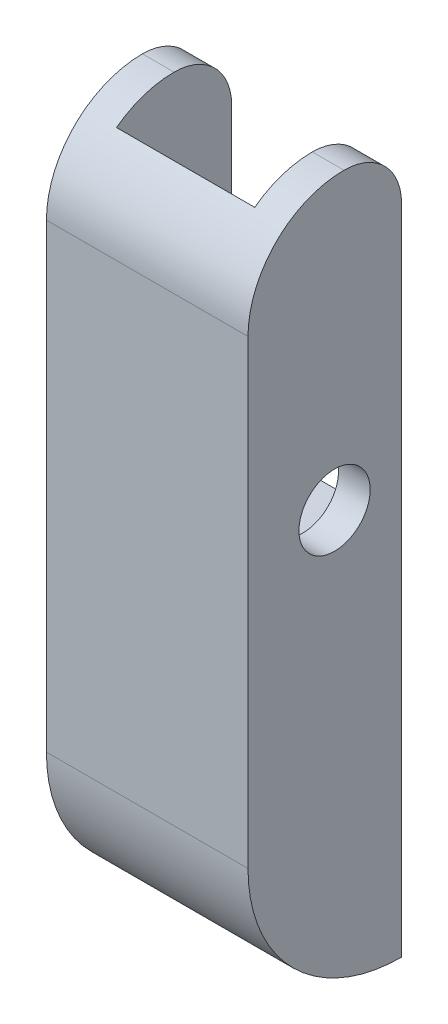
ISO-10303-21;
HEADER;
FILE_DESCRIPTION(('STEP AP214'),'2;1');
FILE_NAME('part.step','',(''),(''),'','','');
FILE_SCHEMA(('AUTOMOTIVE_DESIGN { 1 0 10303 214 1 1 1 1 }'));
ENDSEC;
DATA;
#1=APPLICATION_CONTEXT('core data for automotive mechanical design processes');
#2=APPLICATION_PROTOCOL_DEFINITION('international standard','automotive_design',2000,#1);
#3=PRODUCT_CONTEXT('',#1,'mechanical');
#4=PRODUCT('Part','Part','',(#3));
#5=PRODUCT_RELATED_PRODUCT_CATEGORY('part','',(#4));
#6=PRODUCT_DEFINITION_FORMATION('','',#4);
#7=PRODUCT_DEFINITION_CONTEXT('part definition',#1,'design');
#8=PRODUCT_DEFINITION('design','',#6,#7);
#9=PRODUCT_DEFINITION_SHAPE('','',#8);
#10=(LENGTH_UNIT() NAMED_UNIT(*) SI_UNIT(.MILLI.,.METRE.));
#11=(NAMED_UNIT(*) PLANE_ANGLE_UNIT() SI_UNIT($,.RADIAN.));
#12=(NAMED_UNIT(*) SI_UNIT($,.STERADIAN.) SOLID_ANGLE_UNIT());
#13=UNCERTAINTY_MEASURE_WITH_UNIT(LENGTH_MEASURE(1.E-05),#10,'distance_accuracy_value','');
#14=(GEOMETRIC_REPRESENTATION_CONTEXT(3) GLOBAL_UNCERTAINTY_ASSIGNED_CONTEXT((#13)) GLOBAL_UNIT_ASSIGNED_CONTEXT((#10,
#11,#12)) REPRESENTATION_CONTEXT('',''));
#15=CARTESIAN_POINT('',(0.,0.,0.));
#16=DIRECTION('',(0.,0.,1.));
#17=DIRECTION('',(1.,0.,0.));
#18=AXIS2_PLACEMENT_3D('',#15,#16,#17);
#19=CARTESIAN_POINT('',(0.,43.18,3.81));
#20=DIRECTION('',(-1.,0.,0.));
#21=DIRECTION('',(0.,0.,1.));
#22=AXIS2_PLACEMENT_3D('',#19,#20,#21);
#23=CYLINDRICAL_SURFACE('',#22,3.81);
#24=CARTESIAN_POINT('',(11.2395,43.18,3.81));
#25=DIRECTION('',(1.,0.,0.));
#26=DIRECTION('',(0.,1.,0.));
#27=AXIS2_PLACEMENT_3D('',#24,#25,#26);
#28=CIRCLE('',#27,3.81);
#29=CARTESIAN_POINT('',(11.2395,46.99,3.81));
#30=VERTEX_POINT('',#29);
#31=CARTESIAN_POINT('',(11.2395,43.18,0.));
#32=VERTEX_POINT('',#31);
#33=EDGE_CURVE('E179',#30,#32,#28,.F.);
#34=ORIENTED_EDGE('',*,*,#33,.F.);
#35=DIRECTION('',(1.,0.,0.));
#36=VECTOR('',#35,1.);
#37=CARTESIAN_POINT('',(0.,46.99,3.81));
#38=LINE('',#37,#36);
#39=CARTESIAN_POINT('',(13.335,46.99,3.81));
#40=VERTEX_POINT('',#39);
#41=EDGE_CURVE('E171',#40,#30,#38,.F.);
#42=ORIENTED_EDGE('',*,*,#41,.F.);
#43=CARTESIAN_POINT('',(13.335,43.18,3.81));
#44=DIRECTION('',(-1.,0.,0.));
#45=DIRECTION('',(0.,0.,1.));
#46=AXIS2_PLACEMENT_3D('',#43,#44,#45);
#47=CIRCLE('',#46,3.81);
#48=CARTESIAN_POINT('',(13.335,43.18,0.));
#49=VERTEX_POINT('',#48);
#50=EDGE_CURVE('E168',#49,#40,#47,.F.);
#51=ORIENTED_EDGE('',*,*,#50,.F.);
#52=DIRECTION('',(1.,0.,0.));
#53=VECTOR('',#52,1.);
#54=CARTESIAN_POINT('',(13.335,43.18,0.));
#55=LINE('',#54,#53);
#56=EDGE_CURVE('E158',#32,#49,#55,.T.);
#57=ORIENTED_EDGE('',*,*,#56,.F.);
#58=EDGE_LOOP('',(#34,#42,#51,#57));
#59=FACE_BOUND('',#58,.T.);
#60=ADVANCED_FACE('F41',(#59),#23,.T.);
#61=CARTESIAN_POINT('',(13.335,0.,10.16));
#62=DIRECTION('',(-1.,0.,0.));
#63=DIRECTION('',(0.,0.,1.));
#64=AXIS2_PLACEMENT_3D('',#61,#62,#63);
#65=PLANE('',#64);
#66=CARTESIAN_POINT('',(13.335,27.8257,4.4323));
#67=DIRECTION('',(-1.,0.,0.));
#68=DIRECTION('',(0.,0.,1.));
#69=AXIS2_PLACEMENT_3D('',#66,#67,#68);
#70=CIRCLE('',#69,2.35585);
#71=CARTESIAN_POINT('',(13.335,27.8257,6.78815));
#72=VERTEX_POINT('',#71);
#73=EDGE_CURVE('E186',#72,#72,#70,.T.);
#74=ORIENTED_EDGE('',*,*,#73,.T.);
#75=EDGE_LOOP('',(#74));
#76=FACE_BOUND('',#75,.T.);
#77=DIRECTION('',(0.,1.,0.));
#78=VECTOR('',#77,1.);
#79=CARTESIAN_POINT('',(13.335,0.,10.16));
#80=LINE('',#79,#78);
#81=CARTESIAN_POINT('',(13.335,10.16,10.16));
#82=VERTEX_POINT('',#81);
#83=CARTESIAN_POINT('',(13.335,40.64,10.16));
#84=VERTEX_POINT('',#83);
#85=EDGE_CURVE('E153',#82,#84,#80,.T.);
#86=ORIENTED_EDGE('',*,*,#85,.F.);
#87=CARTESIAN_POINT('',(13.335,10.16,0.));
#88=DIRECTION('',(-1.,0.,0.));
#89=DIRECTION('',(0.,0.,1.));
#90=AXIS2_PLACEMENT_3D('',#87,#88,#89);
#91=CIRCLE('',#90,10.16);
#92=CARTESIAN_POINT('',(13.335,0.,0.));
#93=VERTEX_POINT('',#92);
#94=EDGE_CURVE('E49',#82,#93,#91,.F.);
#95=ORIENTED_EDGE('',*,*,#94,.T.);
#96=DIRECTION('',(0.,1.,0.));
#97=VECTOR('',#96,1.);
#98=CARTESIAN_POINT('',(13.335,0.,0.));
#99=LINE('',#98,#97);
#100=EDGE_CURVE('E160',#93,#49,#99,.T.);
#101=ORIENTED_EDGE('',*,*,#100,.T.);
#102=ORIENTED_EDGE('',*,*,#50,.T.);
#103=CARTESIAN_POINT('',(13.335,40.64,3.81));
#104=DIRECTION('',(-1.,0.,0.));
#105=DIRECTION('',(0.,0.,1.));
#106=AXIS2_PLACEMENT_3D('',#103,#104,#105);
#107=CIRCLE('',#106,6.35);
#108=EDGE_CURVE('E191',#40,#84,#107,.F.);
#109=ORIENTED_EDGE('',*,*,#108,.T.);
#110=EDGE_LOOP('',(#86,#95,#101,#102,#109));
#111=FACE_BOUND('',#110,.T.);
#112=ADVANCED_FACE('F203',(#76,#111),#65,.F.);
#113=CARTESIAN_POINT('',(0.,0.,10.16));
#114=DIRECTION('',(-1.,0.,0.));
#115=DIRECTION('',(0.,0.,1.));
#116=AXIS2_PLACEMENT_3D('',#113,#114,#115);
#117=PLANE('',#116);
#118=CARTESIAN_POINT('',(0.,27.8257,4.4323));
#119=DIRECTION('',(-1.,0.,0.));
#120=DIRECTION('',(0.,0.,1.));
#121=AXIS2_PLACEMENT_3D('',#118,#119,#120);
#122=CIRCLE('',#121,2.35585);
#123=CARTESIAN_POINT('',(0.,27.8257,6.78815));
#124=VERTEX_POINT('',#123);
#125=EDGE_CURVE('E148',#124,#124,#122,.T.);
#126=ORIENTED_EDGE('',*,*,#125,.F.);
#127=EDGE_LOOP('',(#126));
#128=FACE_BOUND('',#127,.T.);
#129=DIRECTION('',(0.,1.,0.));
#130=VECTOR('',#129,1.);
#131=CARTESIAN_POINT('',(0.,0.,0.));
#132=LINE('',#131,#130);
#133=CARTESIAN_POINT('',(0.,0.,0.));
#134=VERTEX_POINT('',#133);
#135=CARTESIAN_POINT('',(0.,43.18,0.));
#136=VERTEX_POINT('',#135);
#137=EDGE_CURVE('E156',#134,#136,#132,.T.);
#138=ORIENTED_EDGE('',*,*,#137,.F.);
#139=CARTESIAN_POINT('',(0.,10.16,0.));
#140=DIRECTION('',(-1.,0.,0.));
#141=DIRECTION('',(0.,0.,1.));
#142=AXIS2_PLACEMENT_3D('',#139,#140,#141);
#143=CIRCLE('',#142,10.16);
#144=CARTESIAN_POINT('',(0.,10.16,10.16));
#145=VERTEX_POINT('',#144);
#146=EDGE_CURVE('E12',#134,#145,#143,.T.);
#147=ORIENTED_EDGE('',*,*,#146,.T.);
#148=DIRECTION('',(0.,1.,0.));
#149=VECTOR('',#148,1.);
#150=CARTESIAN_POINT('',(0.,0.,10.16));
#151=LINE('',#150,#149);
#152=CARTESIAN_POINT('',(0.,40.64,10.16));
#153=VERTEX_POINT('',#152);
#154=EDGE_CURVE('E155',#145,#153,#151,.T.);
#155=ORIENTED_EDGE('',*,*,#154,.T.);
#156=CARTESIAN_POINT('',(0.,40.64,3.81));
#157=DIRECTION('',(-1.,0.,0.));
#158=DIRECTION('',(0.,0.,1.));
#159=AXIS2_PLACEMENT_3D('',#156,#157,#158);
#160=CIRCLE('',#159,6.35);
#161=CARTESIAN_POINT('',(0.,46.99,3.81));
#162=VERTEX_POINT('',#161);
#163=EDGE_CURVE('E197',#153,#162,#160,.T.);
#164=ORIENTED_EDGE('',*,*,#163,.T.);
#165=CARTESIAN_POINT('',(0.,43.18,3.81));
#166=DIRECTION('',(-1.,0.,0.));
#167=DIRECTION('',(0.,0.,1.));
#168=AXIS2_PLACEMENT_3D('',#165,#166,#167);
#169=CIRCLE('',#168,3.81);
#170=EDGE_CURVE('E174',#162,#136,#169,.T.);
#171=ORIENTED_EDGE('',*,*,#170,.T.);
#172=EDGE_LOOP('',(#138,#147,#155,#164,#171));
#173=FACE_BOUND('',#172,.T.);
#174=ADVANCED_FACE('F212',(#128,#173),#117,.T.);
#175=CARTESIAN_POINT('',(0.,0.,10.16));
#176=DIRECTION('',(0.,0.,1.));
#177=DIRECTION('',(1.,0.,0.));
#178=AXIS2_PLACEMENT_3D('',#175,#176,#177);
#179=PLANE('',#178);
#180=ORIENTED_EDGE('',*,*,#154,.F.);
#181=DIRECTION('',(1.,0.,0.));
#182=VECTOR('',#181,1.);
#183=CARTESIAN_POINT('',(13.335,10.16,10.16));
#184=LINE('',#183,#182);
#185=EDGE_CURVE('E199',#145,#82,#184,.T.);
#186=ORIENTED_EDGE('',*,*,#185,.T.);
#187=ORIENTED_EDGE('',*,*,#85,.T.);
#188=DIRECTION('',(1.,0.,0.));
#189=VECTOR('',#188,1.);
#190=CARTESIAN_POINT('',(0.,40.64,10.16));
#191=LINE('',#190,#189);
#192=EDGE_CURVE('E194',#84,#153,#191,.F.);
#193=ORIENTED_EDGE('',*,*,#192,.T.);
#194=EDGE_LOOP('',(#180,#186,#187,#193));
#195=FACE_BOUND('',#194,.T.);
#196=ADVANCED_FACE('F209',(#195),#179,.T.);
#197=CARTESIAN_POINT('',(0.,0.,0.));
#198=DIRECTION('',(0.,0.,1.));
#199=DIRECTION('',(1.,0.,0.));
#200=AXIS2_PLACEMENT_3D('',#197,#198,#199);
#201=PLANE('',#200);
#202=DIRECTION('',(-1.,0.,0.));
#203=VECTOR('',#202,1.);
#204=CARTESIAN_POINT('',(11.2395,24.638,0.));
#205=LINE('',#204,#203);
#206=CARTESIAN_POINT('',(11.2395,24.638,0.));
#207=VERTEX_POINT('',#206);
#208=CARTESIAN_POINT('',(2.0955,24.638,0.));
#209=VERTEX_POINT('',#208);
#210=EDGE_CURVE('E147',#207,#209,#205,.T.);
#211=ORIENTED_EDGE('',*,*,#210,.F.);
#212=DIRECTION('',(0.,-1.,0.));
#213=VECTOR('',#212,1.);
#214=CARTESIAN_POINT('',(11.2395,46.99,0.));
#215=LINE('',#214,#213);
#216=EDGE_CURVE('E133',#32,#207,#215,.T.);
#217=ORIENTED_EDGE('',*,*,#216,.F.);
#218=ORIENTED_EDGE('',*,*,#56,.T.);
#219=ORIENTED_EDGE('',*,*,#100,.F.);
#220=DIRECTION('',(1.,0.,0.));
#221=VECTOR('',#220,1.);
#222=CARTESIAN_POINT('',(0.,0.,0.));
#223=LINE('',#222,#221);
#224=EDGE_CURVE('E151',#134,#93,#223,.T.);
#225=ORIENTED_EDGE('',*,*,#224,.F.);
#226=ORIENTED_EDGE('',*,*,#137,.T.);
#227=CARTESIAN_POINT('',(2.0955,43.18,0.));
#228=VERTEX_POINT('',#227);
#229=EDGE_CURVE('E165',#136,#228,#55,.T.);
#230=ORIENTED_EDGE('',*,*,#229,.T.);
#231=DIRECTION('',(0.,1.,0.));
#232=VECTOR('',#231,1.);
#233=CARTESIAN_POINT('',(2.0955,46.99,0.));
#234=LINE('',#233,#232);
#235=EDGE_CURVE('E127',#209,#228,#234,.T.);
#236=ORIENTED_EDGE('',*,*,#235,.F.);
#237=EDGE_LOOP('',(#211,#217,#218,#219,#225,#226,#230,#236));
#238=FACE_BOUND('',#237,.T.);
#239=ADVANCED_FACE('F205',(#238),#201,.F.);
#240=CARTESIAN_POINT('',(2.0955,43.18,3.81));
#241=DIRECTION('',(-1.,0.,0.));
#242=DIRECTION('',(0.,-1.,0.));
#243=AXIS2_PLACEMENT_3D('',#240,#241,#242);
#244=CIRCLE('',#243,3.81);
#245=CARTESIAN_POINT('',(2.0955,46.99,3.81));
#246=VERTEX_POINT('',#245);
#247=EDGE_CURVE('E176',#228,#246,#244,.F.);
#248=ORIENTED_EDGE('',*,*,#247,.F.);
#249=ORIENTED_EDGE('',*,*,#229,.F.);
#250=ORIENTED_EDGE('',*,*,#170,.F.);
#251=EDGE_CURVE('E170',#246,#162,#38,.F.);
#252=ORIENTED_EDGE('',*,*,#251,.F.);
#253=EDGE_LOOP('',(#248,#249,#250,#252));
#254=FACE_BOUND('',#253,.T.);
#255=ADVANCED_FACE('F220',(#254),#23,.T.);
#256=CARTESIAN_POINT('',(11.2395,46.99,7.62));
#257=DIRECTION('',(1.,0.,0.));
#258=DIRECTION('',(0.,1.,0.));
#259=AXIS2_PLACEMENT_3D('',#256,#257,#258);
#260=PLANE('',#259);
#261=CARTESIAN_POINT('',(11.2395,27.8257,4.4323));
#262=DIRECTION('',(1.,0.,0.));
#263=DIRECTION('',(0.,1.,0.));
#264=AXIS2_PLACEMENT_3D('',#261,#262,#263);
#265=CIRCLE('',#264,2.35585);
#266=CARTESIAN_POINT('',(11.2395,30.18155,4.4323));
#267=VERTEX_POINT('',#266);
#268=EDGE_CURVE('E185',#267,#267,#265,.T.);
#269=ORIENTED_EDGE('',*,*,#268,.T.);
#270=EDGE_LOOP('',(#269));
#271=FACE_BOUND('',#270,.T.);
#272=DIRECTION('',(0.,-1.,0.));
#273=VECTOR('',#272,1.);
#274=CARTESIAN_POINT('',(11.2395,46.99,7.62));
#275=LINE('',#274,#273);
#276=CARTESIAN_POINT('',(11.2395,45.72,7.62));
#277=VERTEX_POINT('',#276);
#278=CARTESIAN_POINT('',(11.2395,24.638,7.62));
#279=VERTEX_POINT('',#278);
#280=EDGE_CURVE('E117',#277,#279,#275,.T.);
#281=ORIENTED_EDGE('',*,*,#280,.F.);
#282=CARTESIAN_POINT('',(11.2395,40.64,3.81));
#283=DIRECTION('',(1.,0.,0.));
#284=DIRECTION('',(0.,1.,0.));
#285=AXIS2_PLACEMENT_3D('',#282,#283,#284);
#286=CIRCLE('',#285,6.35);
#287=EDGE_CURVE('E189',#277,#30,#286,.F.);
#288=ORIENTED_EDGE('',*,*,#287,.T.);
#289=ORIENTED_EDGE('',*,*,#33,.T.);
#290=ORIENTED_EDGE('',*,*,#216,.T.);
#291=DIRECTION('',(0.,0.,-1.));
#292=VECTOR('',#291,1.);
#293=CARTESIAN_POINT('',(11.2395,24.638,7.62));
#294=LINE('',#293,#292);
#295=EDGE_CURVE('E130',#279,#207,#294,.T.);
#296=ORIENTED_EDGE('',*,*,#295,.F.);
#297=EDGE_LOOP('',(#281,#288,#289,#290,#296));
#298=FACE_BOUND('',#297,.T.);
#299=ADVANCED_FACE('F131',(#271,#298),#260,.F.);
#300=CARTESIAN_POINT('',(2.0955,46.99,7.62));
#301=DIRECTION('',(-1.,0.,0.));
#302=DIRECTION('',(0.,-1.,0.));
#303=AXIS2_PLACEMENT_3D('',#300,#301,#302);
#304=PLANE('',#303);
#305=CARTESIAN_POINT('',(2.0955,27.8257,4.4323));
#306=DIRECTION('',(-1.,0.,0.));
#307=DIRECTION('',(0.,-1.,0.));
#308=AXIS2_PLACEMENT_3D('',#305,#306,#307);
#309=CIRCLE('',#308,2.35585);
#310=CARTESIAN_POINT('',(2.0955,25.46985,4.4323));
#311=VERTEX_POINT('',#310);
#312=EDGE_CURVE('E182',#311,#311,#309,.T.);
#313=ORIENTED_EDGE('',*,*,#312,.T.);
#314=EDGE_LOOP('',(#313));
#315=FACE_BOUND('',#314,.T.);
#316=ORIENTED_EDGE('',*,*,#247,.T.);
#317=CARTESIAN_POINT('',(2.0955,40.64,3.81));
#318=DIRECTION('',(-1.,0.,0.));
#319=DIRECTION('',(0.,-1.,0.));
#320=AXIS2_PLACEMENT_3D('',#317,#318,#319);
#321=CIRCLE('',#320,6.35);
#322=CARTESIAN_POINT('',(2.0955,45.72,7.62));
#323=VERTEX_POINT('',#322);
#324=EDGE_CURVE('E181',#246,#323,#321,.F.);
#325=ORIENTED_EDGE('',*,*,#324,.T.);
#326=DIRECTION('',(0.,1.,0.));
#327=VECTOR('',#326,1.);
#328=CARTESIAN_POINT('',(2.0955,46.99,7.62));
#329=LINE('',#328,#327);
#330=CARTESIAN_POINT('',(2.0955,24.638,7.62));
#331=VERTEX_POINT('',#330);
#332=EDGE_CURVE('E138',#331,#323,#329,.T.);
#333=ORIENTED_EDGE('',*,*,#332,.F.);
#334=DIRECTION('',(0.,0.,-1.));
#335=VECTOR('',#334,1.);
#336=CARTESIAN_POINT('',(2.0955,24.638,7.62));
#337=LINE('',#336,#335);
#338=EDGE_CURVE('E137',#331,#209,#337,.T.);
#339=ORIENTED_EDGE('',*,*,#338,.T.);
#340=ORIENTED_EDGE('',*,*,#235,.T.);
#341=EDGE_LOOP('',(#316,#325,#333,#339,#340));
#342=FACE_BOUND('',#341,.T.);
#343=ADVANCED_FACE('F223',(#315,#342),#304,.F.);
#344=CARTESIAN_POINT('',(11.2395,24.638,7.62));
#345=DIRECTION('',(0.,-1.,0.));
#346=DIRECTION('',(0.,0.,-1.));
#347=AXIS2_PLACEMENT_3D('',#344,#345,#346);
#348=PLANE('',#347);
#349=ORIENTED_EDGE('',*,*,#210,.T.);
#350=ORIENTED_EDGE('',*,*,#338,.F.);
#351=DIRECTION('',(-1.,0.,0.));
#352=VECTOR('',#351,1.);
#353=CARTESIAN_POINT('',(11.2395,24.638,7.62));
#354=LINE('',#353,#352);
#355=EDGE_CURVE('E122',#279,#331,#354,.T.);
#356=ORIENTED_EDGE('',*,*,#355,.F.);
#357=ORIENTED_EDGE('',*,*,#295,.T.);
#358=EDGE_LOOP('',(#349,#350,#356,#357));
#359=FACE_BOUND('',#358,.T.);
#360=ADVANCED_FACE('F140',(#359),#348,.F.);
#361=CARTESIAN_POINT('',(0.,0.,7.62));
#362=DIRECTION('',(0.,0.,-1.));
#363=DIRECTION('',(-1.,0.,0.));
#364=AXIS2_PLACEMENT_3D('',#361,#362,#363);
#365=PLANE('',#364);
#366=ORIENTED_EDGE('',*,*,#332,.T.);
#367=DIRECTION('',(1.,0.,0.));
#368=VECTOR('',#367,1.);
#369=CARTESIAN_POINT('',(2.0955,45.72,7.62));
#370=LINE('',#369,#368);
#371=EDGE_CURVE('E124',#323,#277,#370,.T.);
#372=ORIENTED_EDGE('',*,*,#371,.T.);
#373=ORIENTED_EDGE('',*,*,#280,.T.);
#374=ORIENTED_EDGE('',*,*,#355,.T.);
#375=EDGE_LOOP('',(#366,#372,#373,#374));
#376=FACE_BOUND('',#375,.T.);
#377=ADVANCED_FACE('F120',(#376),#365,.T.);
#378=CARTESIAN_POINT('',(13.335,27.8257,4.4323));
#379=DIRECTION('',(-1.,0.,0.));
#380=DIRECTION('',(0.,0.,1.));
#381=AXIS2_PLACEMENT_3D('',#378,#379,#380);
#382=CYLINDRICAL_SURFACE('',#381,2.35585);
#383=ORIENTED_EDGE('',*,*,#125,.T.);
#384=EDGE_LOOP('',(#383));
#385=FACE_BOUND('',#384,.T.);
#386=ORIENTED_EDGE('',*,*,#312,.F.);
#387=EDGE_LOOP('',(#386));
#388=FACE_BOUND('',#387,.T.);
#389=ADVANCED_FACE('F265',(#385,#388),#382,.F.);
#390=ORIENTED_EDGE('',*,*,#73,.F.);
#391=EDGE_LOOP('',(#390));
#392=FACE_BOUND('',#391,.T.);
#393=ORIENTED_EDGE('',*,*,#268,.F.);
#394=EDGE_LOOP('',(#393));
#395=FACE_BOUND('',#394,.T.);
#396=ADVANCED_FACE('F262',(#392,#395),#382,.F.);
#397=CARTESIAN_POINT('',(0.,40.64,3.81));
#398=DIRECTION('',(1.,0.,0.));
#399=DIRECTION('',(0.,0.,-1.));
#400=AXIS2_PLACEMENT_3D('',#397,#398,#399);
#401=CYLINDRICAL_SURFACE('',#400,6.35);
#402=ORIENTED_EDGE('',*,*,#163,.F.);
#403=ORIENTED_EDGE('',*,*,#192,.F.);
#404=ORIENTED_EDGE('',*,*,#108,.F.);
#405=ORIENTED_EDGE('',*,*,#41,.T.);
#406=ORIENTED_EDGE('',*,*,#287,.F.);
#407=ORIENTED_EDGE('',*,*,#371,.F.);
#408=ORIENTED_EDGE('',*,*,#324,.F.);
#409=ORIENTED_EDGE('',*,*,#251,.T.);
#410=EDGE_LOOP('',(#402,#403,#404,#405,#406,#407,#408,#409));
#411=FACE_BOUND('',#410,.T.);
#412=ADVANCED_FACE('F221',(#411),#401,.T.);
#413=CARTESIAN_POINT('',(0.,10.16,0.));
#414=DIRECTION('',(-1.,0.,0.));
#415=DIRECTION('',(0.,0.,1.));
#416=AXIS2_PLACEMENT_3D('',#413,#414,#415);
#417=CYLINDRICAL_SURFACE('',#416,10.16);
#418=ORIENTED_EDGE('',*,*,#146,.F.);
#419=ORIENTED_EDGE('',*,*,#224,.T.);
#420=ORIENTED_EDGE('',*,*,#94,.F.);
#421=ORIENTED_EDGE('',*,*,#185,.F.);
#422=EDGE_LOOP('',(#418,#419,#420,#421));
#423=FACE_BOUND('',#422,.T.);
#424=ADVANCED_FACE('F43',(#423),#417,.T.);
#425=CLOSED_SHELL('',(#60,#112,#174,#196,#239,#255,#299,#343,#360,#377,#389,#396,#412,#424));
#426=MANIFOLD_SOLID_BREP('B2',#425);
#427=ADVANCED_BREP_SHAPE_REPRESENTATION('',(#18,#426),#14);
#428=SHAPE_DEFINITION_REPRESENTATION(#9,#427);
ENDSEC;
END-ISO-10303-21;
